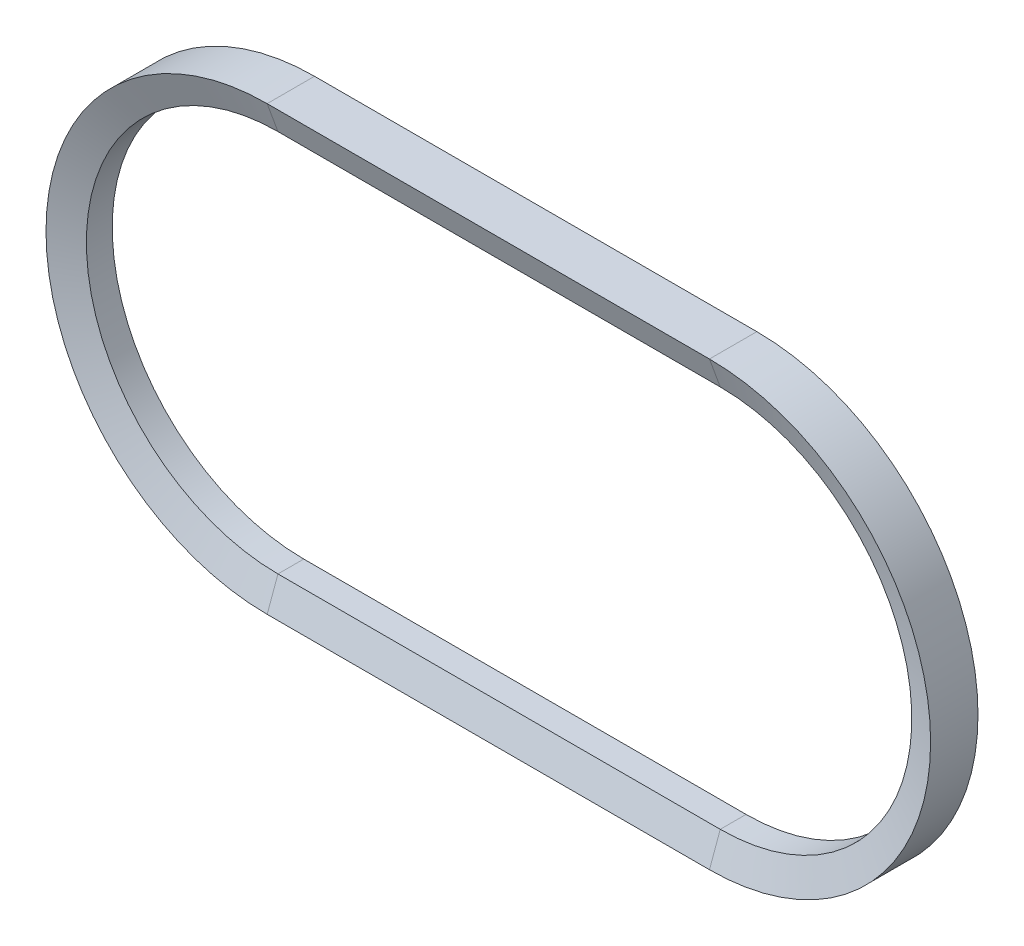
ISO-10303-21;
HEADER;
FILE_DESCRIPTION(('STEP AP214'),'2;1');
FILE_NAME('part.step','',(''),(''),'','','');
FILE_SCHEMA(('AUTOMOTIVE_DESIGN { 1 0 10303 214 1 1 1 1 }'));
ENDSEC;
DATA;
#1=APPLICATION_CONTEXT('core data for automotive mechanical design processes');
#2=APPLICATION_PROTOCOL_DEFINITION('international standard','automotive_design',2000,#1);
#3=PRODUCT_CONTEXT('',#1,'mechanical');
#4=PRODUCT('Part','Part','',(#3));
#5=PRODUCT_RELATED_PRODUCT_CATEGORY('part','',(#4));
#6=PRODUCT_DEFINITION_FORMATION('','',#4);
#7=PRODUCT_DEFINITION_CONTEXT('part definition',#1,'design');
#8=PRODUCT_DEFINITION('design','',#6,#7);
#9=PRODUCT_DEFINITION_SHAPE('','',#8);
#10=(LENGTH_UNIT() NAMED_UNIT(*) SI_UNIT(.MILLI.,.METRE.));
#11=(NAMED_UNIT(*) PLANE_ANGLE_UNIT() SI_UNIT($,.RADIAN.));
#12=(NAMED_UNIT(*) SI_UNIT($,.STERADIAN.) SOLID_ANGLE_UNIT());
#13=UNCERTAINTY_MEASURE_WITH_UNIT(LENGTH_MEASURE(1.E-05),#10,'distance_accuracy_value','');
#14=(GEOMETRIC_REPRESENTATION_CONTEXT(3) GLOBAL_UNCERTAINTY_ASSIGNED_CONTEXT((#13)) GLOBAL_UNIT_ASSIGNED_CONTEXT((#10,
#11,#12)) REPRESENTATION_CONTEXT('',''));
#15=CARTESIAN_POINT('',(0.,0.,0.));
#16=DIRECTION('',(0.,0.,1.));
#17=DIRECTION('',(1.,0.,0.));
#18=AXIS2_PLACEMENT_3D('',#15,#16,#17);
#19=CARTESIAN_POINT('',(0.,29.6406211592037,-3.175));
#20=DIRECTION('',(0.,-1.,0.));
#21=DIRECTION('',(1.,0.,0.));
#22=AXIS2_PLACEMENT_3D('',#19,#20,#21);
#23=PLANE('',#22);
#24=DIRECTION('',(-1.,0.,0.));
#25=VECTOR('',#24,1.);
#26=CARTESIAN_POINT('',(0.,29.6406211592037,3.175));
#27=LINE('',#26,#25);
#28=CARTESIAN_POINT('',(29.6406211592038,29.6406211592035,3.175));
#29=VERTEX_POINT('',#28);
#30=CARTESIAN_POINT('',(-29.6406211592038,29.6406211592037,3.175));
#31=VERTEX_POINT('',#30);
#32=EDGE_CURVE('E146',#29,#31,#27,.T.);
#33=ORIENTED_EDGE('',*,*,#32,.F.);
#34=DIRECTION('',(0.,0.,1.));
#35=VECTOR('',#34,1.);
#36=CARTESIAN_POINT('',(29.6406211592038,29.6406211592035,-3.175));
#37=LINE('',#36,#35);
#38=CARTESIAN_POINT('',(29.6406211592038,29.6406211592035,-3.175));
#39=VERTEX_POINT('',#38);
#40=EDGE_CURVE('E135',#39,#29,#37,.T.);
#41=ORIENTED_EDGE('',*,*,#40,.F.);
#42=DIRECTION('',(-1.,0.,0.));
#43=VECTOR('',#42,1.);
#44=CARTESIAN_POINT('',(0.,29.6406211592037,-3.175));
#45=LINE('',#44,#43);
#46=CARTESIAN_POINT('',(-29.6406211592038,29.6406211592037,-3.175));
#47=VERTEX_POINT('',#46);
#48=EDGE_CURVE('E131',#39,#47,#45,.T.);
#49=ORIENTED_EDGE('',*,*,#48,.T.);
#50=DIRECTION('',(0.,0.,1.));
#51=VECTOR('',#50,1.);
#52=CARTESIAN_POINT('',(-29.6406211592038,29.6406211592037,-3.175));
#53=LINE('',#52,#51);
#54=EDGE_CURVE('E133',#47,#31,#53,.T.);
#55=ORIENTED_EDGE('',*,*,#54,.T.);
#56=EDGE_LOOP('',(#33,#41,#49,#55));
#57=FACE_BOUND('',#56,.T.);
#58=ADVANCED_FACE('F37',(#57),#23,.F.);
#59=CARTESIAN_POINT('',(0.,29.6406211592037,3.175));
#60=DIRECTION('',(0.,0.34202014332567,-0.939692620785908));
#61=DIRECTION('',(0.,0.939692620785908,0.34202014332567));
#62=AXIS2_PLACEMENT_3D('',#59,#60,#61);
#63=PLANE('',#62);
#64=DIRECTION('',(-1.,0.,0.));
#65=VECTOR('',#64,1.);
#66=CARTESIAN_POINT('',(0.,25.6718711592037,1.730493132756));
#67=LINE('',#66,#65);
#68=CARTESIAN_POINT('',(29.6406211592038,25.6718711592035,1.730493132756));
#69=VERTEX_POINT('',#68);
#70=CARTESIAN_POINT('',(-29.6406211592038,25.6718711592037,1.730493132756));
#71=VERTEX_POINT('',#70);
#72=EDGE_CURVE('E61',#69,#71,#67,.T.);
#73=ORIENTED_EDGE('',*,*,#72,.F.);
#74=DIRECTION('',(0.,-0.939692620785908,-0.34202014332567));
#75=VECTOR('',#74,1.);
#76=CARTESIAN_POINT('',(29.6406211592038,29.6406211592035,3.175));
#77=LINE('',#76,#75);
#78=EDGE_CURVE('E173',#29,#69,#77,.T.);
#79=ORIENTED_EDGE('',*,*,#78,.F.);
#80=ORIENTED_EDGE('',*,*,#32,.T.);
#81=DIRECTION('',(0.,-0.939692620785908,-0.34202014332567));
#82=VECTOR('',#81,1.);
#83=CARTESIAN_POINT('',(-29.6406211592038,29.6406211592037,3.175));
#84=LINE('',#83,#82);
#85=EDGE_CURVE('E176',#31,#71,#84,.T.);
#86=ORIENTED_EDGE('',*,*,#85,.T.);
#87=EDGE_LOOP('',(#73,#79,#80,#86));
#88=FACE_BOUND('',#87,.T.);
#89=ADVANCED_FACE('F218',(#88),#63,.F.);
#90=CARTESIAN_POINT('',(0.,25.6718711592037,1.730493132756));
#91=DIRECTION('',(0.,1.,0.));
#92=DIRECTION('',(-1.,0.,0.));
#93=AXIS2_PLACEMENT_3D('',#90,#91,#92);
#94=PLANE('',#93);
#95=DIRECTION('',(-1.,0.,0.));
#96=VECTOR('',#95,1.);
#97=CARTESIAN_POINT('',(0.,25.6718711592037,-1.730493132756));
#98=LINE('',#97,#96);
#99=CARTESIAN_POINT('',(29.6406211592038,25.6718711592035,-1.730493132756));
#100=VERTEX_POINT('',#99);
#101=CARTESIAN_POINT('',(-29.6406211592038,25.6718711592037,-1.730493132756));
#102=VERTEX_POINT('',#101);
#103=EDGE_CURVE('E52',#100,#102,#98,.T.);
#104=ORIENTED_EDGE('',*,*,#103,.F.);
#105=DIRECTION('',(0.,0.,-1.));
#106=VECTOR('',#105,1.);
#107=CARTESIAN_POINT('',(29.6406211592038,25.6718711592035,1.730493132756));
#108=LINE('',#107,#106);
#109=EDGE_CURVE('E191',#69,#100,#108,.T.);
#110=ORIENTED_EDGE('',*,*,#109,.F.);
#111=ORIENTED_EDGE('',*,*,#72,.T.);
#112=DIRECTION('',(0.,0.,-1.));
#113=VECTOR('',#112,1.);
#114=CARTESIAN_POINT('',(-29.6406211592038,25.6718711592037,1.730493132756));
#115=LINE('',#114,#113);
#116=EDGE_CURVE('E179',#71,#102,#115,.T.);
#117=ORIENTED_EDGE('',*,*,#116,.T.);
#118=EDGE_LOOP('',(#104,#110,#111,#117));
#119=FACE_BOUND('',#118,.T.);
#120=ADVANCED_FACE('F217',(#119),#94,.F.);
#121=CARTESIAN_POINT('',(0.,29.6406211592037,-3.175));
#122=DIRECTION('',(0.,0.34202014332567,0.939692620785908));
#123=DIRECTION('',(0.,-0.939692620785908,0.34202014332567));
#124=AXIS2_PLACEMENT_3D('',#121,#122,#123);
#125=PLANE('',#124);
#126=DIRECTION('',(0.,0.939692620785908,-0.34202014332567));
#127=VECTOR('',#126,1.);
#128=CARTESIAN_POINT('',(-29.6406211592038,29.6406211592037,-3.175));
#129=LINE('',#128,#127);
#130=EDGE_CURVE('E149',#102,#47,#129,.T.);
#131=ORIENTED_EDGE('',*,*,#130,.T.);
#132=ORIENTED_EDGE('',*,*,#48,.F.);
#133=DIRECTION('',(0.,0.939692620785908,-0.34202014332567));
#134=VECTOR('',#133,1.);
#135=CARTESIAN_POINT('',(29.6406211592038,29.6406211592035,-3.175));
#136=LINE('',#135,#134);
#137=EDGE_CURVE('E11',#100,#39,#136,.T.);
#138=ORIENTED_EDGE('',*,*,#137,.F.);
#139=ORIENTED_EDGE('',*,*,#103,.T.);
#140=EDGE_LOOP('',(#131,#132,#138,#139));
#141=FACE_BOUND('',#140,.T.);
#142=ADVANCED_FACE('F150',(#141),#125,.F.);
#143=CARTESIAN_POINT('',(-29.6406211592038,0.,0.));
#144=DIRECTION('',(0.,0.,1.));
#145=DIRECTION('',(1.,0.,0.));
#146=AXIS2_PLACEMENT_3D('',#143,#144,#145);
#147=CYLINDRICAL_SURFACE('',#146,29.6406211592037);
#148=CARTESIAN_POINT('',(-29.6406211592038,0.,3.175));
#149=DIRECTION('',(0.,0.,1.));
#150=DIRECTION('',(0.,1.,0.));
#151=AXIS2_PLACEMENT_3D('',#148,#149,#150);
#152=CIRCLE('',#151,29.6406211592037);
#153=CARTESIAN_POINT('',(-29.6406211592038,-29.6406211592038,3.175));
#154=VERTEX_POINT('',#153);
#155=EDGE_CURVE('E119',#31,#154,#152,.T.);
#156=ORIENTED_EDGE('',*,*,#155,.F.);
#157=ORIENTED_EDGE('',*,*,#54,.F.);
#158=CARTESIAN_POINT('',(-29.6406211592038,0.,-3.175));
#159=DIRECTION('',(0.,0.,1.));
#160=DIRECTION('',(0.,1.,0.));
#161=AXIS2_PLACEMENT_3D('',#158,#159,#160);
#162=CIRCLE('',#161,29.6406211592037);
#163=CARTESIAN_POINT('',(-29.6406211592038,-29.6406211592038,-3.175));
#164=VERTEX_POINT('',#163);
#165=EDGE_CURVE('E144',#47,#164,#162,.T.);
#166=ORIENTED_EDGE('',*,*,#165,.T.);
#167=DIRECTION('',(0.,0.,1.));
#168=VECTOR('',#167,1.);
#169=CARTESIAN_POINT('',(-29.6406211592038,-29.6406211592038,-3.175));
#170=LINE('',#169,#168);
#171=EDGE_CURVE('E157',#164,#154,#170,.T.);
#172=ORIENTED_EDGE('',*,*,#171,.T.);
#173=EDGE_LOOP('',(#156,#157,#166,#172));
#174=FACE_BOUND('',#173,.T.);
#175=ADVANCED_FACE('F142',(#174),#147,.T.);
#176=CARTESIAN_POINT('',(-29.6406211592038,0.,3.175));
#177=DIRECTION('',(0.,0.,1.));
#178=DIRECTION('',(1.,0.,0.));
#179=AXIS2_PLACEMENT_3D('',#176,#177,#178);
#180=CONICAL_SURFACE('',#179,29.6406211592037,1.22173047639603);
#181=CARTESIAN_POINT('',(-29.6406211592038,0.,1.730493132756));
#182=DIRECTION('',(0.,0.,1.));
#183=DIRECTION('',(0.,1.,0.));
#184=AXIS2_PLACEMENT_3D('',#181,#182,#183);
#185=CIRCLE('',#184,25.6718711592037);
#186=CARTESIAN_POINT('',(-29.6406211592038,-25.6718711592038,1.730493132756));
#187=VERTEX_POINT('',#186);
#188=EDGE_CURVE('E113',#71,#187,#185,.T.);
#189=ORIENTED_EDGE('',*,*,#188,.F.);
#190=ORIENTED_EDGE('',*,*,#85,.F.);
#191=ORIENTED_EDGE('',*,*,#155,.T.);
#192=DIRECTION('',(0.,0.939692620785908,-0.34202014332567));
#193=VECTOR('',#192,1.);
#194=CARTESIAN_POINT('',(-29.6406211592038,-29.6406211592038,3.175));
#195=LINE('',#194,#193);
#196=EDGE_CURVE('E180',#154,#187,#195,.T.);
#197=ORIENTED_EDGE('',*,*,#196,.T.);
#198=EDGE_LOOP('',(#189,#190,#191,#197));
#199=FACE_BOUND('',#198,.T.);
#200=ADVANCED_FACE('F214',(#199),#180,.F.);
#201=CARTESIAN_POINT('',(-29.6406211592038,0.,0.));
#202=DIRECTION('',(0.,0.,1.));
#203=DIRECTION('',(1.,0.,0.));
#204=AXIS2_PLACEMENT_3D('',#201,#202,#203);
#205=CYLINDRICAL_SURFACE('',#204,25.6718711592037);
#206=CARTESIAN_POINT('',(-29.6406211592038,0.,-1.730493132756));
#207=DIRECTION('',(0.,0.,1.));
#208=DIRECTION('',(0.,1.,0.));
#209=AXIS2_PLACEMENT_3D('',#206,#207,#208);
#210=CIRCLE('',#209,25.6718711592037);
#211=CARTESIAN_POINT('',(-29.6406211592038,-25.6718711592038,-1.730493132756));
#212=VERTEX_POINT('',#211);
#213=EDGE_CURVE('E195',#102,#212,#210,.T.);
#214=ORIENTED_EDGE('',*,*,#213,.F.);
#215=ORIENTED_EDGE('',*,*,#116,.F.);
#216=ORIENTED_EDGE('',*,*,#188,.T.);
#217=DIRECTION('',(0.,0.,-1.));
#218=VECTOR('',#217,1.);
#219=CARTESIAN_POINT('',(-29.6406211592038,-25.6718711592038,1.730493132756));
#220=LINE('',#219,#218);
#221=EDGE_CURVE('E183',#187,#212,#220,.T.);
#222=ORIENTED_EDGE('',*,*,#221,.T.);
#223=EDGE_LOOP('',(#214,#215,#216,#222));
#224=FACE_BOUND('',#223,.T.);
#225=ADVANCED_FACE('F216',(#224),#205,.F.);
#226=CARTESIAN_POINT('',(-29.6406211592038,0.,-1.73049313275601));
#227=DIRECTION('',(0.,0.,-1.));
#228=DIRECTION('',(-1.,0.,0.));
#229=AXIS2_PLACEMENT_3D('',#226,#227,#228);
#230=CONICAL_SURFACE('',#229,25.6718711592037,1.22173047639603);
#231=DIRECTION('',(0.,-0.939692620785908,-0.34202014332567));
#232=VECTOR('',#231,1.);
#233=CARTESIAN_POINT('',(-29.6406211592038,-29.6406211592038,-3.175));
#234=LINE('',#233,#232);
#235=EDGE_CURVE('E155',#212,#164,#234,.T.);
#236=ORIENTED_EDGE('',*,*,#235,.T.);
#237=ORIENTED_EDGE('',*,*,#165,.F.);
#238=ORIENTED_EDGE('',*,*,#130,.F.);
#239=ORIENTED_EDGE('',*,*,#213,.T.);
#240=EDGE_LOOP('',(#236,#237,#238,#239));
#241=FACE_BOUND('',#240,.T.);
#242=ADVANCED_FACE('F154',(#241),#230,.F.);
#243=CARTESIAN_POINT('',(-29.6406211592038,-29.6406211592038,-3.175));
#244=DIRECTION('',(0.,1.,0.));
#245=DIRECTION('',(-1.,0.,0.));
#246=AXIS2_PLACEMENT_3D('',#243,#244,#245);
#247=PLANE('',#246);
#248=DIRECTION('',(1.,0.,0.));
#249=VECTOR('',#248,1.);
#250=CARTESIAN_POINT('',(-29.6406211592038,-29.6406211592038,3.175));
#251=LINE('',#250,#249);
#252=CARTESIAN_POINT('',(29.6406211592038,-29.6406211592037,3.175));
#253=VERTEX_POINT('',#252);
#254=EDGE_CURVE('E100',#154,#253,#251,.T.);
#255=ORIENTED_EDGE('',*,*,#254,.F.);
#256=ORIENTED_EDGE('',*,*,#171,.F.);
#257=DIRECTION('',(1.,0.,0.));
#258=VECTOR('',#257,1.);
#259=CARTESIAN_POINT('',(-29.6406211592038,-29.6406211592038,-3.175));
#260=LINE('',#259,#258);
#261=CARTESIAN_POINT('',(29.6406211592038,-29.6406211592037,-3.175));
#262=VERTEX_POINT('',#261);
#263=EDGE_CURVE('E166',#164,#262,#260,.T.);
#264=ORIENTED_EDGE('',*,*,#263,.T.);
#265=DIRECTION('',(0.,0.,1.));
#266=VECTOR('',#265,1.);
#267=CARTESIAN_POINT('',(29.6406211592038,-29.6406211592037,-3.175));
#268=LINE('',#267,#266);
#269=EDGE_CURVE('E162',#262,#253,#268,.T.);
#270=ORIENTED_EDGE('',*,*,#269,.T.);
#271=EDGE_LOOP('',(#255,#256,#264,#270));
#272=FACE_BOUND('',#271,.T.);
#273=ADVANCED_FACE('F212',(#272),#247,.F.);
#274=CARTESIAN_POINT('',(-29.6406211592038,-29.6406211592038,3.175));
#275=DIRECTION('',(0.,-0.34202014332567,-0.939692620785908));
#276=DIRECTION('',(0.,0.939692620785908,-0.34202014332567));
#277=AXIS2_PLACEMENT_3D('',#274,#275,#276);
#278=PLANE('',#277);
#279=DIRECTION('',(1.,0.,0.));
#280=VECTOR('',#279,1.);
#281=CARTESIAN_POINT('',(-29.6406211592038,-25.6718711592038,1.730493132756));
#282=LINE('',#281,#280);
#283=CARTESIAN_POINT('',(29.6406211592038,-25.6718711592037,1.730493132756));
#284=VERTEX_POINT('',#283);
#285=EDGE_CURVE('E93',#187,#284,#282,.T.);
#286=ORIENTED_EDGE('',*,*,#285,.F.);
#287=ORIENTED_EDGE('',*,*,#196,.F.);
#288=ORIENTED_EDGE('',*,*,#254,.T.);
#289=DIRECTION('',(0.,0.939692620785908,-0.34202014332567));
#290=VECTOR('',#289,1.);
#291=CARTESIAN_POINT('',(29.6406211592038,-29.6406211592037,3.175));
#292=LINE('',#291,#290);
#293=EDGE_CURVE('E164',#253,#284,#292,.T.);
#294=ORIENTED_EDGE('',*,*,#293,.T.);
#295=EDGE_LOOP('',(#286,#287,#288,#294));
#296=FACE_BOUND('',#295,.T.);
#297=ADVANCED_FACE('F213',(#296),#278,.F.);
#298=CARTESIAN_POINT('',(-29.6406211592038,-25.6718711592038,1.730493132756));
#299=DIRECTION('',(0.,-1.,0.));
#300=DIRECTION('',(1.,0.,0.));
#301=AXIS2_PLACEMENT_3D('',#298,#299,#300);
#302=PLANE('',#301);
#303=DIRECTION('',(1.,0.,0.));
#304=VECTOR('',#303,1.);
#305=CARTESIAN_POINT('',(-29.6406211592038,-25.6718711592038,-1.730493132756));
#306=LINE('',#305,#304);
#307=CARTESIAN_POINT('',(29.6406211592038,-25.6718711592037,-1.730493132756));
#308=VERTEX_POINT('',#307);
#309=EDGE_CURVE('E84',#212,#308,#306,.T.);
#310=ORIENTED_EDGE('',*,*,#309,.F.);
#311=ORIENTED_EDGE('',*,*,#221,.F.);
#312=ORIENTED_EDGE('',*,*,#285,.T.);
#313=DIRECTION('',(0.,0.,-1.));
#314=VECTOR('',#313,1.);
#315=CARTESIAN_POINT('',(29.6406211592038,-25.6718711592037,1.730493132756));
#316=LINE('',#315,#314);
#317=EDGE_CURVE('E185',#284,#308,#316,.T.);
#318=ORIENTED_EDGE('',*,*,#317,.T.);
#319=EDGE_LOOP('',(#310,#311,#312,#318));
#320=FACE_BOUND('',#319,.T.);
#321=ADVANCED_FACE('F227',(#320),#302,.F.);
#322=CARTESIAN_POINT('',(-29.6406211592038,-29.6406211592038,-3.175));
#323=DIRECTION('',(0.,-0.34202014332567,0.939692620785908));
#324=DIRECTION('',(0.,-0.939692620785908,-0.34202014332567));
#325=AXIS2_PLACEMENT_3D('',#322,#323,#324);
#326=PLANE('',#325);
#327=DIRECTION('',(0.,-0.939692620785908,-0.34202014332567));
#328=VECTOR('',#327,1.);
#329=CARTESIAN_POINT('',(29.6406211592038,-29.6406211592037,-3.175));
#330=LINE('',#329,#328);
#331=EDGE_CURVE('E175',#308,#262,#330,.T.);
#332=ORIENTED_EDGE('',*,*,#331,.T.);
#333=ORIENTED_EDGE('',*,*,#263,.F.);
#334=ORIENTED_EDGE('',*,*,#235,.F.);
#335=ORIENTED_EDGE('',*,*,#309,.T.);
#336=EDGE_LOOP('',(#332,#333,#334,#335));
#337=FACE_BOUND('',#336,.T.);
#338=ADVANCED_FACE('F204',(#337),#326,.F.);
#339=CARTESIAN_POINT('',(29.6406211592038,-1.77903076317008E-13,0.));
#340=DIRECTION('',(0.,0.,1.));
#341=DIRECTION('',(1.,0.,0.));
#342=AXIS2_PLACEMENT_3D('',#339,#340,#341);
#343=CYLINDRICAL_SURFACE('',#342,29.6406211592037);
#344=CARTESIAN_POINT('',(29.6406211592038,-1.77903076317008E-13,3.175));
#345=DIRECTION('',(0.,0.,1.));
#346=DIRECTION('',(0.,-1.,0.));
#347=AXIS2_PLACEMENT_3D('',#344,#345,#346);
#348=CIRCLE('',#347,29.6406211592037);
#349=EDGE_CURVE('E169',#253,#29,#348,.T.);
#350=ORIENTED_EDGE('',*,*,#349,.F.);
#351=ORIENTED_EDGE('',*,*,#269,.F.);
#352=CARTESIAN_POINT('',(29.6406211592038,-1.77903076317008E-13,-3.175));
#353=DIRECTION('',(0.,0.,1.));
#354=DIRECTION('',(0.,-1.,0.));
#355=AXIS2_PLACEMENT_3D('',#352,#353,#354);
#356=CIRCLE('',#355,29.6406211592037);
#357=EDGE_CURVE('E170',#262,#39,#356,.T.);
#358=ORIENTED_EDGE('',*,*,#357,.T.);
#359=ORIENTED_EDGE('',*,*,#40,.T.);
#360=EDGE_LOOP('',(#350,#351,#358,#359));
#361=FACE_BOUND('',#360,.T.);
#362=ADVANCED_FACE('F209',(#361),#343,.T.);
#363=CARTESIAN_POINT('',(29.6406211592038,-1.77903076317008E-13,3.175));
#364=DIRECTION('',(0.,0.,1.));
#365=DIRECTION('',(1.,0.,0.));
#366=AXIS2_PLACEMENT_3D('',#363,#364,#365);
#367=CONICAL_SURFACE('',#366,29.6406211592037,1.22173047639603);
#368=CARTESIAN_POINT('',(29.6406211592038,-1.77903076317008E-13,1.730493132756));
#369=DIRECTION('',(0.,0.,1.));
#370=DIRECTION('',(0.,-1.,0.));
#371=AXIS2_PLACEMENT_3D('',#368,#369,#370);
#372=CIRCLE('',#371,25.6718711592037);
#373=EDGE_CURVE('E189',#284,#69,#372,.T.);
#374=ORIENTED_EDGE('',*,*,#373,.F.);
#375=ORIENTED_EDGE('',*,*,#293,.F.);
#376=ORIENTED_EDGE('',*,*,#349,.T.);
#377=ORIENTED_EDGE('',*,*,#78,.T.);
#378=EDGE_LOOP('',(#374,#375,#376,#377));
#379=FACE_BOUND('',#378,.T.);
#380=ADVANCED_FACE('F222',(#379),#367,.F.);
#381=CARTESIAN_POINT('',(29.6406211592038,-1.77903076317008E-13,0.));
#382=DIRECTION('',(0.,0.,1.));
#383=DIRECTION('',(1.,0.,0.));
#384=AXIS2_PLACEMENT_3D('',#381,#382,#383);
#385=CYLINDRICAL_SURFACE('',#384,25.6718711592037);
#386=CARTESIAN_POINT('',(29.6406211592038,-1.77903076317008E-13,-1.730493132756));
#387=DIRECTION('',(0.,0.,1.));
#388=DIRECTION('',(0.,-1.,0.));
#389=AXIS2_PLACEMENT_3D('',#386,#387,#388);
#390=CIRCLE('',#389,25.6718711592037);
#391=EDGE_CURVE('E45',#308,#100,#390,.T.);
#392=ORIENTED_EDGE('',*,*,#391,.F.);
#393=ORIENTED_EDGE('',*,*,#317,.F.);
#394=ORIENTED_EDGE('',*,*,#373,.T.);
#395=ORIENTED_EDGE('',*,*,#109,.T.);
#396=EDGE_LOOP('',(#392,#393,#394,#395));
#397=FACE_BOUND('',#396,.T.);
#398=ADVANCED_FACE('F226',(#397),#385,.F.);
#399=CARTESIAN_POINT('',(29.6406211592038,-1.77903076317008E-13,-1.73049313275601));
#400=DIRECTION('',(0.,0.,-1.));
#401=DIRECTION('',(-1.,0.,0.));
#402=AXIS2_PLACEMENT_3D('',#399,#400,#401);
#403=CONICAL_SURFACE('',#402,25.6718711592037,1.22173047639603);
#404=ORIENTED_EDGE('',*,*,#137,.T.);
#405=ORIENTED_EDGE('',*,*,#357,.F.);
#406=ORIENTED_EDGE('',*,*,#331,.F.);
#407=ORIENTED_EDGE('',*,*,#391,.T.);
#408=EDGE_LOOP('',(#404,#405,#406,#407));
#409=FACE_BOUND('',#408,.T.);
#410=ADVANCED_FACE('F39',(#409),#403,.F.);
#411=CLOSED_SHELL('',(#58,#89,#120,#142,#175,#200,#225,#242,#273,#297,#321,#338,#362,#380,#398,#410));
#412=MANIFOLD_SOLID_BREP('B2',#411);
#413=ADVANCED_BREP_SHAPE_REPRESENTATION('',(#18,#412),#14);
#414=SHAPE_DEFINITION_REPRESENTATION(#9,#413);
ENDSEC;
END-ISO-10303-21;
